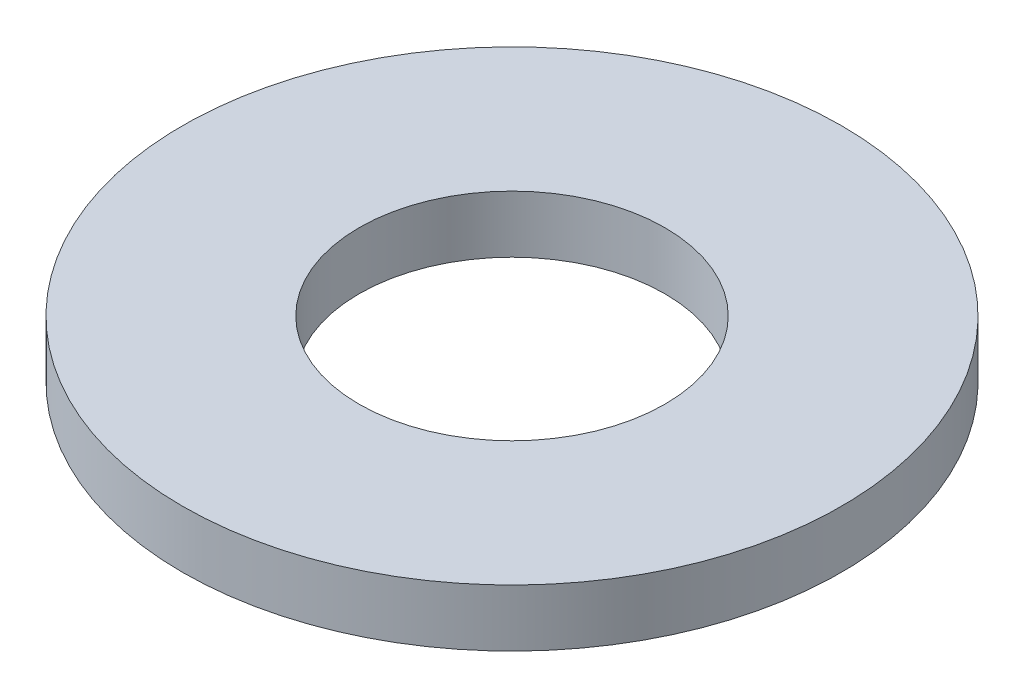
ISO-10303-21;
HEADER;
FILE_DESCRIPTION(('STEP AP214'),'2;1');
FILE_NAME('part.step','',(''),(''),'','','');
FILE_SCHEMA(('AUTOMOTIVE_DESIGN { 1 0 10303 214 1 1 1 1 }'));
ENDSEC;
DATA;
#1=APPLICATION_CONTEXT('core data for automotive mechanical design processes');
#2=APPLICATION_PROTOCOL_DEFINITION('international standard','automotive_design',2000,#1);
#3=PRODUCT_CONTEXT('',#1,'mechanical');
#4=PRODUCT('Part','Part','',(#3));
#5=PRODUCT_RELATED_PRODUCT_CATEGORY('part','',(#4));
#6=PRODUCT_DEFINITION_FORMATION('','',#4);
#7=PRODUCT_DEFINITION_CONTEXT('part definition',#1,'design');
#8=PRODUCT_DEFINITION('design','',#6,#7);
#9=PRODUCT_DEFINITION_SHAPE('','',#8);
#10=(LENGTH_UNIT() NAMED_UNIT(*) SI_UNIT(.MILLI.,.METRE.));
#11=(NAMED_UNIT(*) PLANE_ANGLE_UNIT() SI_UNIT($,.RADIAN.));
#12=(NAMED_UNIT(*) SI_UNIT($,.STERADIAN.) SOLID_ANGLE_UNIT());
#13=UNCERTAINTY_MEASURE_WITH_UNIT(LENGTH_MEASURE(1.E-05),#10,'distance_accuracy_value','');
#14=(GEOMETRIC_REPRESENTATION_CONTEXT(3) GLOBAL_UNCERTAINTY_ASSIGNED_CONTEXT((#13)) GLOBAL_UNIT_ASSIGNED_CONTEXT((#10,
#11,#12)) REPRESENTATION_CONTEXT('',''));
#15=CARTESIAN_POINT('',(0.,0.,0.));
#16=DIRECTION('',(0.,0.,1.));
#17=DIRECTION('',(1.,0.,0.));
#18=AXIS2_PLACEMENT_3D('',#15,#16,#17);
#19=CARTESIAN_POINT('',(0.,0.9652,0.));
#20=DIRECTION('',(0.,-1.,0.));
#21=DIRECTION('',(0.,0.,-1.));
#22=AXIS2_PLACEMENT_3D('',#19,#20,#21);
#23=CYLINDRICAL_SURFACE('',#22,5.55625);
#24=CARTESIAN_POINT('',(0.,0.9652,0.));
#25=DIRECTION('',(0.,1.,0.));
#26=DIRECTION('',(0.,0.,1.));
#27=AXIS2_PLACEMENT_3D('',#24,#25,#26);
#28=CIRCLE('',#27,5.55625);
#29=CARTESIAN_POINT('',(0.,0.9652,-5.55625));
#30=VERTEX_POINT('',#29);
#31=EDGE_CURVE('E10',#30,#30,#28,.T.);
#32=CARTESIAN_POINT('',(0.,0.,0.));
#33=DIRECTION('',(0.,1.,0.));
#34=DIRECTION('',(0.,0.,1.));
#35=AXIS2_PLACEMENT_3D('',#32,#33,#34);
#36=CIRCLE('',#35,5.55625);
#37=CARTESIAN_POINT('',(0.,0.,-5.55625));
#38=VERTEX_POINT('',#37);
#39=EDGE_CURVE('E33',#38,#38,#36,.T.);
#40=CARTESIAN_POINT('',(0.,0.9652,-5.55625));
#41=CARTESIAN_POINT('',(0.,0.955145833333333,-5.55625));
#42=CARTESIAN_POINT('',(0.,0.945091666666667,-5.55625));
#43=CARTESIAN_POINT('',(0.,0.924983333333333,-5.55625));
#44=CARTESIAN_POINT('',(0.,0.914929166666667,-5.55625));
#45=CARTESIAN_POINT('',(0.,0.894820833333333,-5.55625));
#46=CARTESIAN_POINT('',(0.,0.884766666666667,-5.55625));
#47=CARTESIAN_POINT('',(0.,0.864658333333333,-5.55625));
#48=CARTESIAN_POINT('',(0.,0.854604166666667,-5.55625));
#49=CARTESIAN_POINT('',(0.,0.834495833333333,-5.55625));
#50=CARTESIAN_POINT('',(0.,0.824441666666667,-5.55625));
#51=CARTESIAN_POINT('',(0.,0.804333333333333,-5.55625));
#52=CARTESIAN_POINT('',(0.,0.794279166666667,-5.55625));
#53=CARTESIAN_POINT('',(0.,0.774170833333333,-5.55625));
#54=CARTESIAN_POINT('',(0.,0.764116666666667,-5.55625));
#55=CARTESIAN_POINT('',(0.,0.744008333333333,-5.55625));
#56=CARTESIAN_POINT('',(0.,0.733954166666667,-5.55625));
#57=CARTESIAN_POINT('',(0.,0.713845833333333,-5.55625));
#58=CARTESIAN_POINT('',(0.,0.703791666666667,-5.55625));
#59=CARTESIAN_POINT('',(0.,0.683683333333333,-5.55625));
#60=CARTESIAN_POINT('',(0.,0.673629166666667,-5.55625));
#61=CARTESIAN_POINT('',(0.,0.653520833333333,-5.55625));
#62=CARTESIAN_POINT('',(0.,0.643466666666667,-5.55625));
#63=CARTESIAN_POINT('',(0.,0.623358333333333,-5.55625));
#64=CARTESIAN_POINT('',(0.,0.613304166666667,-5.55625));
#65=CARTESIAN_POINT('',(0.,0.593195833333333,-5.55625));
#66=CARTESIAN_POINT('',(0.,0.583141666666667,-5.55625));
#67=CARTESIAN_POINT('',(0.,0.563033333333333,-5.55625));
#68=CARTESIAN_POINT('',(0.,0.552979166666667,-5.55625));
#69=CARTESIAN_POINT('',(0.,0.532870833333333,-5.55625));
#70=CARTESIAN_POINT('',(0.,0.522816666666667,-5.55625));
#71=CARTESIAN_POINT('',(0.,0.502708333333333,-5.55625));
#72=CARTESIAN_POINT('',(0.,0.492654166666667,-5.55625));
#73=CARTESIAN_POINT('',(0.,0.472545833333333,-5.55625));
#74=CARTESIAN_POINT('',(0.,0.462491666666667,-5.55625));
#75=CARTESIAN_POINT('',(0.,0.442383333333333,-5.55625));
#76=CARTESIAN_POINT('',(0.,0.432329166666667,-5.55625));
#77=CARTESIAN_POINT('',(0.,0.412220833333333,-5.55625));
#78=CARTESIAN_POINT('',(0.,0.402166666666667,-5.55625));
#79=CARTESIAN_POINT('',(0.,0.382058333333333,-5.55625));
#80=CARTESIAN_POINT('',(0.,0.372004166666667,-5.55625));
#81=CARTESIAN_POINT('',(0.,0.351895833333333,-5.55625));
#82=CARTESIAN_POINT('',(0.,0.341841666666667,-5.55625));
#83=CARTESIAN_POINT('',(0.,0.321733333333333,-5.55625));
#84=CARTESIAN_POINT('',(0.,0.311679166666667,-5.55625));
#85=CARTESIAN_POINT('',(0.,0.291570833333333,-5.55625));
#86=CARTESIAN_POINT('',(0.,0.281516666666667,-5.55625));
#87=CARTESIAN_POINT('',(0.,0.261408333333333,-5.55625));
#88=CARTESIAN_POINT('',(0.,0.251354166666667,-5.55625));
#89=CARTESIAN_POINT('',(0.,0.231245833333333,-5.55625));
#90=CARTESIAN_POINT('',(0.,0.221191666666667,-5.55625));
#91=CARTESIAN_POINT('',(0.,0.201083333333333,-5.55625));
#92=CARTESIAN_POINT('',(0.,0.191029166666667,-5.55625));
#93=CARTESIAN_POINT('',(0.,0.170920833333333,-5.55625));
#94=CARTESIAN_POINT('',(0.,0.160866666666667,-5.55625));
#95=CARTESIAN_POINT('',(0.,0.140758333333333,-5.55625));
#96=CARTESIAN_POINT('',(0.,0.130704166666667,-5.55625));
#97=CARTESIAN_POINT('',(0.,0.110595833333333,-5.55625));
#98=CARTESIAN_POINT('',(0.,0.100541666666667,-5.55625));
#99=CARTESIAN_POINT('',(0.,0.0804333333333333,-5.55625));
#100=CARTESIAN_POINT('',(0.,0.0703791666666666,-5.55625));
#101=CARTESIAN_POINT('',(0.,0.0502708333333333,-5.55625));
#102=CARTESIAN_POINT('',(0.,0.0402166666666666,-5.55625));
#103=CARTESIAN_POINT('',(0.,0.0201083333333333,-5.55625));
#104=CARTESIAN_POINT('',(0.,0.0100541666666667,-5.55625));
#105=CARTESIAN_POINT('',(0.,0.,-5.55625));
#106=B_SPLINE_CURVE_WITH_KNOTS('',3,(#40,#41,#42,#43,#44,#45,#46,#47,#48,#49,#50,#51,#52,#53,
#54,#55,#56,#57,#58,#59,#60,#61,#62,#63,#64,#65,#66,#67,#68,#69,#70,#71,#72,#73,#74,#75,#76,#77,
#78,#79,#80,#81,#82,#83,#84,#85,#86,#87,#88,#89,#90,#91,#92,#93,#94,#95,#96,#97,#98,#99,#100,
#101,#102,#103,#104,#105),.UNSPECIFIED.,.F.,.F.,(4,2,2,2,2,2,2,2,2,2,2,2,2,2,2,2,2,2,2,2,2,2,2,
2,2,2,2,2,2,2,2,2,4),(0.,0.0301625,0.060325,0.0904874999999999,0.12065,0.1508125,0.180975,
0.2111375,0.2413,0.2714625,0.301625,0.3317875,0.36195,0.3921125,0.422275,0.4524375,0.4826,
0.5127625,0.542925,0.5730875,0.60325,0.6334125,0.663575,0.6937375,0.7239,0.7540625,0.784225,
0.8143875,0.84455,0.8747125,0.904875,0.9350375,0.9652),.UNSPECIFIED.);
#107=EDGE_CURVE('BSEAM30',#30,#38,#106,.T.);
#108=ORIENTED_EDGE('',*,*,#31,.F.);
#109=ORIENTED_EDGE('',*,*,#39,.T.);
#110=ORIENTED_EDGE('',*,*,#107,.T.);
#111=ORIENTED_EDGE('',*,*,#107,.F.);
#112=EDGE_LOOP('',(#108,#110,#109,#111));
#113=FACE_BOUND('',#112,.T.);
#114=ADVANCED_FACE('F30',(#113),#23,.T.);
#115=CARTESIAN_POINT('',(0.,0.9652,0.));
#116=DIRECTION('',(0.,1.,0.));
#117=DIRECTION('',(0.,0.,1.));
#118=AXIS2_PLACEMENT_3D('',#115,#116,#117);
#119=PLANE('',#118);
#120=CARTESIAN_POINT('',(0.,0.9652,0.));
#121=DIRECTION('',(0.,1.,0.));
#122=DIRECTION('',(0.,0.,1.));
#123=AXIS2_PLACEMENT_3D('',#120,#121,#122);
#124=CIRCLE('',#123,2.5781);
#125=CARTESIAN_POINT('',(0.,0.9652,2.5781));
#126=VERTEX_POINT('',#125);
#127=EDGE_CURVE('E42',#126,#126,#124,.T.);
#128=ORIENTED_EDGE('',*,*,#127,.F.);
#129=EDGE_LOOP('',(#128));
#130=FACE_BOUND('',#129,.T.);
#131=ORIENTED_EDGE('',*,*,#31,.T.);
#132=EDGE_LOOP('',(#131));
#133=FACE_BOUND('',#132,.T.);
#134=ADVANCED_FACE('F57',(#130,#133),#119,.T.);
#135=CARTESIAN_POINT('',(0.,0.,0.));
#136=DIRECTION('',(0.,1.,0.));
#137=DIRECTION('',(0.,0.,1.));
#138=AXIS2_PLACEMENT_3D('',#135,#136,#137);
#139=PLANE('',#138);
#140=CARTESIAN_POINT('',(0.,0.,0.));
#141=DIRECTION('',(0.,1.,0.));
#142=DIRECTION('',(0.,0.,1.));
#143=AXIS2_PLACEMENT_3D('',#140,#141,#142);
#144=CIRCLE('',#143,2.5781);
#145=CARTESIAN_POINT('',(0.,0.,2.5781));
#146=VERTEX_POINT('',#145);
#147=EDGE_CURVE('E40',#146,#146,#144,.T.);
#148=ORIENTED_EDGE('',*,*,#147,.T.);
#149=EDGE_LOOP('',(#148));
#150=FACE_BOUND('',#149,.T.);
#151=ORIENTED_EDGE('',*,*,#39,.F.);
#152=EDGE_LOOP('',(#151));
#153=FACE_BOUND('',#152,.T.);
#154=ADVANCED_FACE('F48',(#150,#153),#139,.F.);
#155=CARTESIAN_POINT('',(0.,0.,0.));
#156=DIRECTION('',(0.,1.,0.));
#157=DIRECTION('',(0.,0.,1.));
#158=AXIS2_PLACEMENT_3D('',#155,#156,#157);
#159=CYLINDRICAL_SURFACE('',#158,2.5781);
#160=CARTESIAN_POINT('',(0.,0.,2.5781));
#161=CARTESIAN_POINT('',(0.,0.0100541666666667,2.5781));
#162=CARTESIAN_POINT('',(0.,0.0201083333333333,2.5781));
#163=CARTESIAN_POINT('',(0.,0.0402166666666667,2.5781));
#164=CARTESIAN_POINT('',(0.,0.0502708333333333,2.5781));
#165=CARTESIAN_POINT('',(0.,0.0703791666666667,2.5781));
#166=CARTESIAN_POINT('',(0.,0.0804333333333333,2.5781));
#167=CARTESIAN_POINT('',(0.,0.100541666666667,2.5781));
#168=CARTESIAN_POINT('',(0.,0.110595833333333,2.5781));
#169=CARTESIAN_POINT('',(0.,0.130704166666667,2.5781));
#170=CARTESIAN_POINT('',(0.,0.140758333333333,2.5781));
#171=CARTESIAN_POINT('',(0.,0.160866666666667,2.5781));
#172=CARTESIAN_POINT('',(0.,0.170920833333333,2.5781));
#173=CARTESIAN_POINT('',(0.,0.191029166666667,2.5781));
#174=CARTESIAN_POINT('',(0.,0.201083333333333,2.5781));
#175=CARTESIAN_POINT('',(0.,0.221191666666667,2.5781));
#176=CARTESIAN_POINT('',(0.,0.231245833333333,2.5781));
#177=CARTESIAN_POINT('',(0.,0.251354166666667,2.5781));
#178=CARTESIAN_POINT('',(0.,0.261408333333333,2.5781));
#179=CARTESIAN_POINT('',(0.,0.281516666666667,2.5781));
#180=CARTESIAN_POINT('',(0.,0.291570833333333,2.5781));
#181=CARTESIAN_POINT('',(0.,0.311679166666667,2.5781));
#182=CARTESIAN_POINT('',(0.,0.321733333333333,2.5781));
#183=CARTESIAN_POINT('',(0.,0.341841666666667,2.5781));
#184=CARTESIAN_POINT('',(0.,0.351895833333333,2.5781));
#185=CARTESIAN_POINT('',(0.,0.372004166666667,2.5781));
#186=CARTESIAN_POINT('',(0.,0.382058333333333,2.5781));
#187=CARTESIAN_POINT('',(0.,0.402166666666667,2.5781));
#188=CARTESIAN_POINT('',(0.,0.412220833333333,2.5781));
#189=CARTESIAN_POINT('',(0.,0.432329166666667,2.5781));
#190=CARTESIAN_POINT('',(0.,0.442383333333333,2.5781));
#191=CARTESIAN_POINT('',(0.,0.462491666666667,2.5781));
#192=CARTESIAN_POINT('',(0.,0.472545833333333,2.5781));
#193=CARTESIAN_POINT('',(0.,0.492654166666667,2.5781));
#194=CARTESIAN_POINT('',(0.,0.502708333333333,2.5781));
#195=CARTESIAN_POINT('',(0.,0.522816666666667,2.5781));
#196=CARTESIAN_POINT('',(0.,0.532870833333333,2.5781));
#197=CARTESIAN_POINT('',(0.,0.552979166666667,2.5781));
#198=CARTESIAN_POINT('',(0.,0.563033333333333,2.5781));
#199=CARTESIAN_POINT('',(0.,0.583141666666667,2.5781));
#200=CARTESIAN_POINT('',(0.,0.593195833333333,2.5781));
#201=CARTESIAN_POINT('',(0.,0.613304166666667,2.5781));
#202=CARTESIAN_POINT('',(0.,0.623358333333333,2.5781));
#203=CARTESIAN_POINT('',(0.,0.643466666666667,2.5781));
#204=CARTESIAN_POINT('',(0.,0.653520833333333,2.5781));
#205=CARTESIAN_POINT('',(0.,0.673629166666667,2.5781));
#206=CARTESIAN_POINT('',(0.,0.683683333333333,2.5781));
#207=CARTESIAN_POINT('',(0.,0.703791666666667,2.5781));
#208=CARTESIAN_POINT('',(0.,0.713845833333333,2.5781));
#209=CARTESIAN_POINT('',(0.,0.733954166666667,2.5781));
#210=CARTESIAN_POINT('',(0.,0.744008333333333,2.5781));
#211=CARTESIAN_POINT('',(0.,0.764116666666667,2.5781));
#212=CARTESIAN_POINT('',(0.,0.774170833333333,2.5781));
#213=CARTESIAN_POINT('',(0.,0.794279166666667,2.5781));
#214=CARTESIAN_POINT('',(0.,0.804333333333333,2.5781));
#215=CARTESIAN_POINT('',(0.,0.824441666666667,2.5781));
#216=CARTESIAN_POINT('',(0.,0.834495833333333,2.5781));
#217=CARTESIAN_POINT('',(0.,0.854604166666667,2.5781));
#218=CARTESIAN_POINT('',(0.,0.864658333333333,2.5781));
#219=CARTESIAN_POINT('',(0.,0.884766666666667,2.5781));
#220=CARTESIAN_POINT('',(0.,0.894820833333333,2.5781));
#221=CARTESIAN_POINT('',(0.,0.914929166666667,2.5781));
#222=CARTESIAN_POINT('',(0.,0.924983333333333,2.5781));
#223=CARTESIAN_POINT('',(0.,0.945091666666667,2.5781));
#224=CARTESIAN_POINT('',(0.,0.955145833333333,2.5781));
#225=CARTESIAN_POINT('',(0.,0.9652,2.5781));
#226=B_SPLINE_CURVE_WITH_KNOTS('',3,(#160,#161,#162,#163,#164,#165,#166,#167,#168,#169,#170,
#171,#172,#173,#174,#175,#176,#177,#178,#179,#180,#181,#182,#183,#184,#185,#186,#187,#188,#189,
#190,#191,#192,#193,#194,#195,#196,#197,#198,#199,#200,#201,#202,#203,#204,#205,#206,#207,#208,
#209,#210,#211,#212,#213,#214,#215,#216,#217,#218,#219,#220,#221,#222,#223,#224,#225),
.UNSPECIFIED.,.F.,.F.,(4,2,2,2,2,2,2,2,2,2,2,2,2,2,2,2,2,2,2,2,2,2,2,2,2,2,2,2,2,2,2,2,4),(0.,
0.0301625,0.060325,0.0904875,0.12065,0.1508125,0.180975,0.2111375,0.2413,0.2714625,0.301625,
0.3317875,0.36195,0.3921125,0.422275,0.4524375,0.4826,0.5127625,0.542925,0.5730875,0.60325,
0.6334125,0.663575,0.6937375,0.7239,0.7540625,0.784225,0.8143875,0.84455,0.8747125,0.904875,
0.9350375,0.9652),.UNSPECIFIED.);
#227=EDGE_CURVE('BSEAM51',#146,#126,#226,.T.);
#228=ORIENTED_EDGE('',*,*,#147,.F.);
#229=ORIENTED_EDGE('',*,*,#127,.T.);
#230=ORIENTED_EDGE('',*,*,#227,.T.);
#231=ORIENTED_EDGE('',*,*,#227,.F.);
#232=EDGE_LOOP('',(#228,#230,#229,#231));
#233=FACE_BOUND('',#232,.T.);
#234=ADVANCED_FACE('F51',(#233),#159,.F.);
#235=CLOSED_SHELL('',(#114,#134,#154,#234));
#236=MANIFOLD_SOLID_BREP('B2',#235);
#237=ADVANCED_BREP_SHAPE_REPRESENTATION('',(#18,#236),#14);
#238=SHAPE_DEFINITION_REPRESENTATION(#9,#237);
ENDSEC;
END-ISO-10303-21;
